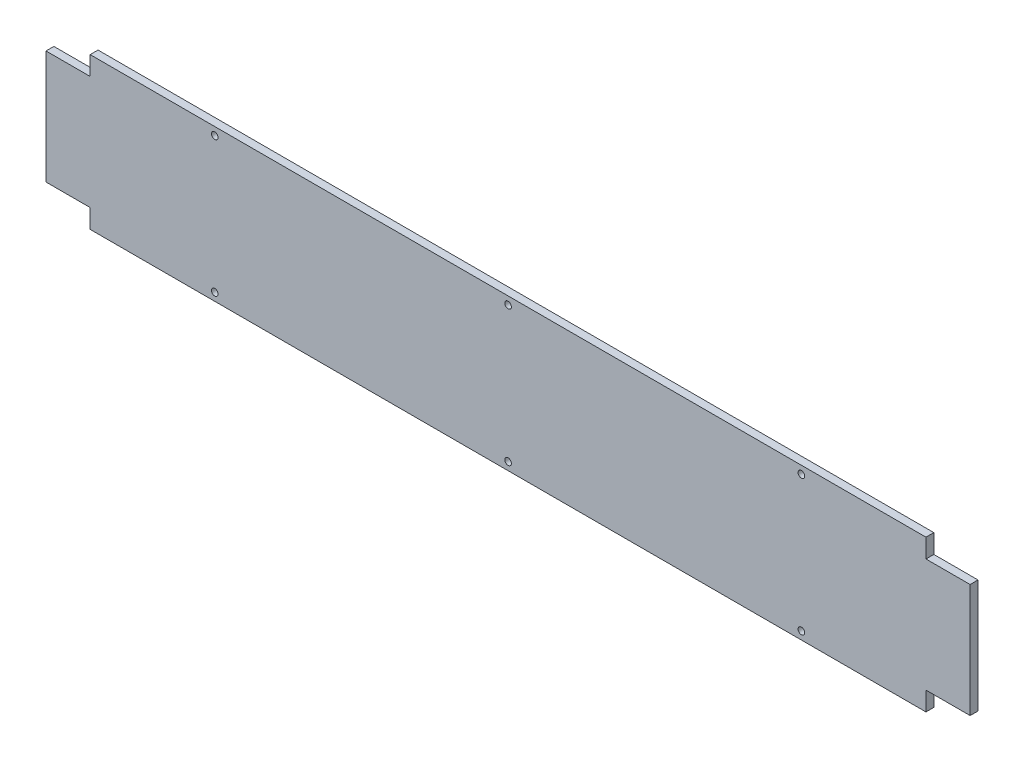
ISO-10303-21;
HEADER;
FILE_DESCRIPTION(('STEP AP214'),'2;1');
FILE_NAME('part.step','',(''),(''),'','','');
FILE_SCHEMA(('AUTOMOTIVE_DESIGN { 1 0 10303 214 1 1 1 1 }'));
ENDSEC;
DATA;
#1=APPLICATION_CONTEXT('core data for automotive mechanical design processes');
#2=APPLICATION_PROTOCOL_DEFINITION('international standard','automotive_design',2000,#1);
#3=PRODUCT_CONTEXT('',#1,'mechanical');
#4=PRODUCT('Part','Part','',(#3));
#5=PRODUCT_RELATED_PRODUCT_CATEGORY('part','',(#4));
#6=PRODUCT_DEFINITION_FORMATION('','',#4);
#7=PRODUCT_DEFINITION_CONTEXT('part definition',#1,'design');
#8=PRODUCT_DEFINITION('design','',#6,#7);
#9=PRODUCT_DEFINITION_SHAPE('','',#8);
#10=(LENGTH_UNIT() NAMED_UNIT(*) SI_UNIT(.MILLI.,.METRE.));
#11=(NAMED_UNIT(*) PLANE_ANGLE_UNIT() SI_UNIT($,.RADIAN.));
#12=(NAMED_UNIT(*) SI_UNIT($,.STERADIAN.) SOLID_ANGLE_UNIT());
#13=UNCERTAINTY_MEASURE_WITH_UNIT(LENGTH_MEASURE(1.E-05),#10,'distance_accuracy_value','');
#14=(GEOMETRIC_REPRESENTATION_CONTEXT(3) GLOBAL_UNCERTAINTY_ASSIGNED_CONTEXT((#13)) GLOBAL_UNIT_ASSIGNED_CONTEXT((#10,
#11,#12)) REPRESENTATION_CONTEXT('',''));
#15=CARTESIAN_POINT('',(0.,0.,0.));
#16=DIRECTION('',(0.,0.,1.));
#17=DIRECTION('',(1.,0.,0.));
#18=AXIS2_PLACEMENT_3D('',#15,#16,#17);
#19=CARTESIAN_POINT('',(0.,0.,5.));
#20=DIRECTION('',(1.,0.,0.));
#21=DIRECTION('',(0.,0.,-1.));
#22=AXIS2_PLACEMENT_3D('',#19,#20,#21);
#23=PLANE('',#22);
#24=DIRECTION('',(0.,0.,1.));
#25=VECTOR('',#24,1.);
#26=CARTESIAN_POINT('',(0.,12.,0.));
#27=LINE('',#26,#25);
#28=CARTESIAN_POINT('',(0.,12.,0.));
#29=VERTEX_POINT('',#28);
#30=CARTESIAN_POINT('',(0.,12.,5.));
#31=VERTEX_POINT('',#30);
#32=EDGE_CURVE('E135',#29,#31,#27,.T.);
#33=ORIENTED_EDGE('',*,*,#32,.F.);
#34=DIRECTION('',(0.,-1.,0.));
#35=VECTOR('',#34,1.);
#36=CARTESIAN_POINT('',(0.,0.,0.));
#37=LINE('',#36,#35);
#38=CARTESIAN_POINT('',(0.,0.,0.));
#39=VERTEX_POINT('',#38);
#40=EDGE_CURVE('E188',#29,#39,#37,.T.);
#41=ORIENTED_EDGE('',*,*,#40,.T.);
#42=DIRECTION('',(0.,0.,-1.));
#43=VECTOR('',#42,1.);
#44=CARTESIAN_POINT('',(0.,0.,5.));
#45=LINE('',#44,#43);
#46=CARTESIAN_POINT('',(0.,0.,5.));
#47=VERTEX_POINT('',#46);
#48=EDGE_CURVE('E11',#47,#39,#45,.T.);
#49=ORIENTED_EDGE('',*,*,#48,.F.);
#50=DIRECTION('',(0.,-1.,0.));
#51=VECTOR('',#50,1.);
#52=CARTESIAN_POINT('',(0.,0.,5.));
#53=LINE('',#52,#51);
#54=EDGE_CURVE('E151',#31,#47,#53,.T.);
#55=ORIENTED_EDGE('',*,*,#54,.F.);
#56=EDGE_LOOP('',(#33,#41,#49,#55));
#57=FACE_BOUND('',#56,.T.);
#58=ADVANCED_FACE('F45',(#57),#23,.F.);
#59=CARTESIAN_POINT('',(530.,0.,5.));
#60=DIRECTION('',(-1.,0.,0.));
#61=DIRECTION('',(0.,0.,1.));
#62=AXIS2_PLACEMENT_3D('',#59,#60,#61);
#63=PLANE('',#62);
#64=DIRECTION('',(0.,0.,1.));
#65=VECTOR('',#64,1.);
#66=CARTESIAN_POINT('',(530.,84.,0.));
#67=LINE('',#66,#65);
#68=CARTESIAN_POINT('',(530.,84.,0.));
#69=VERTEX_POINT('',#68);
#70=CARTESIAN_POINT('',(530.,84.,5.));
#71=VERTEX_POINT('',#70);
#72=EDGE_CURVE('E241',#69,#71,#67,.T.);
#73=ORIENTED_EDGE('',*,*,#72,.F.);
#74=DIRECTION('',(0.,1.,0.));
#75=VECTOR('',#74,1.);
#76=CARTESIAN_POINT('',(530.,0.,0.));
#77=LINE('',#76,#75);
#78=CARTESIAN_POINT('',(530.,96.,0.));
#79=VERTEX_POINT('',#78);
#80=EDGE_CURVE('E191',#69,#79,#77,.T.);
#81=ORIENTED_EDGE('',*,*,#80,.T.);
#82=DIRECTION('',(0.,0.,-1.));
#83=VECTOR('',#82,1.);
#84=CARTESIAN_POINT('',(530.,96.,5.));
#85=LINE('',#84,#83);
#86=CARTESIAN_POINT('',(530.,96.,5.));
#87=VERTEX_POINT('',#86);
#88=EDGE_CURVE('E198',#87,#79,#85,.T.);
#89=ORIENTED_EDGE('',*,*,#88,.F.);
#90=DIRECTION('',(0.,1.,0.));
#91=VECTOR('',#90,1.);
#92=CARTESIAN_POINT('',(530.,0.,5.));
#93=LINE('',#92,#91);
#94=EDGE_CURVE('E174',#71,#87,#93,.T.);
#95=ORIENTED_EDGE('',*,*,#94,.F.);
#96=EDGE_LOOP('',(#73,#81,#89,#95));
#97=FACE_BOUND('',#96,.T.);
#98=ADVANCED_FACE('F320',(#97),#63,.F.);
#99=CARTESIAN_POINT('',(0.,96.,0.));
#100=VERTEX_POINT('',#99);
#101=CARTESIAN_POINT('',(0.,84.,0.));
#102=VERTEX_POINT('',#101);
#103=EDGE_CURVE('E183',#100,#102,#37,.T.);
#104=ORIENTED_EDGE('',*,*,#103,.T.);
#105=DIRECTION('',(0.,0.,1.));
#106=VECTOR('',#105,1.);
#107=CARTESIAN_POINT('',(0.,84.,0.));
#108=LINE('',#107,#106);
#109=CARTESIAN_POINT('',(0.,84.,5.));
#110=VERTEX_POINT('',#109);
#111=EDGE_CURVE('E334',#102,#110,#108,.T.);
#112=ORIENTED_EDGE('',*,*,#111,.T.);
#113=CARTESIAN_POINT('',(0.,96.,5.));
#114=VERTEX_POINT('',#113);
#115=EDGE_CURVE('E160',#114,#110,#53,.T.);
#116=ORIENTED_EDGE('',*,*,#115,.F.);
#117=DIRECTION('',(0.,0.,-1.));
#118=VECTOR('',#117,1.);
#119=CARTESIAN_POINT('',(0.,96.,5.));
#120=LINE('',#119,#118);
#121=EDGE_CURVE('E182',#114,#100,#120,.T.);
#122=ORIENTED_EDGE('',*,*,#121,.T.);
#123=EDGE_LOOP('',(#104,#112,#116,#122));
#124=FACE_BOUND('',#123,.T.);
#125=ADVANCED_FACE('F47',(#124),#23,.F.);
#126=CARTESIAN_POINT('',(0.,0.,5.));
#127=DIRECTION('',(0.,1.,0.));
#128=DIRECTION('',(0.,0.,1.));
#129=AXIS2_PLACEMENT_3D('',#126,#127,#128);
#130=PLANE('',#129);
#131=DIRECTION('',(1.,0.,0.));
#132=VECTOR('',#131,1.);
#133=CARTESIAN_POINT('',(0.,0.,0.));
#134=LINE('',#133,#132);
#135=CARTESIAN_POINT('',(530.,0.,0.));
#136=VERTEX_POINT('',#135);
#137=EDGE_CURVE('E187',#39,#136,#134,.T.);
#138=ORIENTED_EDGE('',*,*,#137,.T.);
#139=DIRECTION('',(0.,0.,-1.));
#140=VECTOR('',#139,1.);
#141=CARTESIAN_POINT('',(530.,0.,5.));
#142=LINE('',#141,#140);
#143=CARTESIAN_POINT('',(530.,0.,5.));
#144=VERTEX_POINT('',#143);
#145=EDGE_CURVE('E54',#144,#136,#142,.T.);
#146=ORIENTED_EDGE('',*,*,#145,.F.);
#147=DIRECTION('',(1.,0.,0.));
#148=VECTOR('',#147,1.);
#149=CARTESIAN_POINT('',(0.,0.,5.));
#150=LINE('',#149,#148);
#151=EDGE_CURVE('E165',#47,#144,#150,.T.);
#152=ORIENTED_EDGE('',*,*,#151,.F.);
#153=ORIENTED_EDGE('',*,*,#48,.T.);
#154=EDGE_LOOP('',(#138,#146,#152,#153));
#155=FACE_BOUND('',#154,.T.);
#156=ADVANCED_FACE('F328',(#155),#130,.F.);
#157=CARTESIAN_POINT('',(530.,12.,0.));
#158=VERTEX_POINT('',#157);
#159=EDGE_CURVE('E166',#136,#158,#77,.T.);
#160=ORIENTED_EDGE('',*,*,#159,.T.);
#161=DIRECTION('',(0.,0.,1.));
#162=VECTOR('',#161,1.);
#163=CARTESIAN_POINT('',(530.,12.,0.));
#164=LINE('',#163,#162);
#165=CARTESIAN_POINT('',(530.,12.,5.));
#166=VERTEX_POINT('',#165);
#167=EDGE_CURVE('E235',#158,#166,#164,.T.);
#168=ORIENTED_EDGE('',*,*,#167,.T.);
#169=EDGE_CURVE('E175',#144,#166,#93,.T.);
#170=ORIENTED_EDGE('',*,*,#169,.F.);
#171=ORIENTED_EDGE('',*,*,#145,.T.);
#172=EDGE_LOOP('',(#160,#168,#170,#171));
#173=FACE_BOUND('',#172,.T.);
#174=ADVANCED_FACE('F207',(#173),#63,.F.);
#175=CARTESIAN_POINT('',(0.,96.,5.));
#176=DIRECTION('',(0.,-1.,0.));
#177=DIRECTION('',(0.,0.,-1.));
#178=AXIS2_PLACEMENT_3D('',#175,#176,#177);
#179=PLANE('',#178);
#180=DIRECTION('',(-1.,0.,0.));
#181=VECTOR('',#180,1.);
#182=CARTESIAN_POINT('',(0.,96.,0.));
#183=LINE('',#182,#181);
#184=EDGE_CURVE('E161',#79,#100,#183,.T.);
#185=ORIENTED_EDGE('',*,*,#184,.T.);
#186=ORIENTED_EDGE('',*,*,#121,.F.);
#187=DIRECTION('',(-1.,0.,0.));
#188=VECTOR('',#187,1.);
#189=CARTESIAN_POINT('',(0.,96.,5.));
#190=LINE('',#189,#188);
#191=EDGE_CURVE('E179',#87,#114,#190,.T.);
#192=ORIENTED_EDGE('',*,*,#191,.F.);
#193=ORIENTED_EDGE('',*,*,#88,.T.);
#194=EDGE_LOOP('',(#185,#186,#192,#193));
#195=FACE_BOUND('',#194,.T.);
#196=ADVANCED_FACE('F304',(#195),#179,.F.);
#197=CARTESIAN_POINT('',(0.,0.,5.));
#198=DIRECTION('',(0.,0.,-1.));
#199=DIRECTION('',(-1.,0.,0.));
#200=AXIS2_PLACEMENT_3D('',#197,#198,#199);
#201=PLANE('',#200);
#202=CARTESIAN_POINT('',(79.,5.,5.));
#203=DIRECTION('',(0.,0.,1.));
#204=DIRECTION('',(-1.,0.,0.));
#205=AXIS2_PLACEMENT_3D('',#202,#203,#204);
#206=CIRCLE('',#205,2.1);
#207=CARTESIAN_POINT('',(76.9,5.,5.));
#208=VERTEX_POINT('',#207);
#209=EDGE_CURVE('E285',#208,#208,#206,.T.);
#210=ORIENTED_EDGE('',*,*,#209,.F.);
#211=EDGE_LOOP('',(#210));
#212=FACE_BOUND('',#211,.T.);
#213=CARTESIAN_POINT('',(265.,5.,5.));
#214=DIRECTION('',(0.,0.,1.));
#215=DIRECTION('',(-1.,0.,0.));
#216=AXIS2_PLACEMENT_3D('',#213,#214,#215);
#217=CIRCLE('',#216,2.09999999999999);
#218=CARTESIAN_POINT('',(262.9,5.,5.));
#219=VERTEX_POINT('',#218);
#220=EDGE_CURVE('E277',#219,#219,#217,.T.);
#221=ORIENTED_EDGE('',*,*,#220,.F.);
#222=EDGE_LOOP('',(#221));
#223=FACE_BOUND('',#222,.T.);
#224=CARTESIAN_POINT('',(451.,5.,5.));
#225=DIRECTION('',(0.,0.,1.));
#226=DIRECTION('',(-1.,0.,0.));
#227=AXIS2_PLACEMENT_3D('',#224,#225,#226);
#228=CIRCLE('',#227,2.09999999999999);
#229=CARTESIAN_POINT('',(448.9,5.,5.));
#230=VERTEX_POINT('',#229);
#231=EDGE_CURVE('E269',#230,#230,#228,.T.);
#232=ORIENTED_EDGE('',*,*,#231,.F.);
#233=EDGE_LOOP('',(#232));
#234=FACE_BOUND('',#233,.T.);
#235=CARTESIAN_POINT('',(451.,91.,5.));
#236=DIRECTION('',(0.,0.,1.));
#237=DIRECTION('',(1.,0.,0.));
#238=AXIS2_PLACEMENT_3D('',#235,#236,#237);
#239=CIRCLE('',#238,2.09999999999999);
#240=CARTESIAN_POINT('',(453.1,91.,5.));
#241=VERTEX_POINT('',#240);
#242=EDGE_CURVE('E261',#241,#241,#239,.T.);
#243=ORIENTED_EDGE('',*,*,#242,.F.);
#244=EDGE_LOOP('',(#243));
#245=FACE_BOUND('',#244,.T.);
#246=CARTESIAN_POINT('',(265.,91.,5.));
#247=DIRECTION('',(0.,0.,1.));
#248=DIRECTION('',(1.,0.,0.));
#249=AXIS2_PLACEMENT_3D('',#246,#247,#248);
#250=CIRCLE('',#249,2.09999999999999);
#251=CARTESIAN_POINT('',(267.1,91.,5.));
#252=VERTEX_POINT('',#251);
#253=EDGE_CURVE('E253',#252,#252,#250,.T.);
#254=ORIENTED_EDGE('',*,*,#253,.F.);
#255=EDGE_LOOP('',(#254));
#256=FACE_BOUND('',#255,.T.);
#257=CARTESIAN_POINT('',(79.,91.,5.));
#258=DIRECTION('',(0.,0.,1.));
#259=DIRECTION('',(1.,0.,0.));
#260=AXIS2_PLACEMENT_3D('',#257,#258,#259);
#261=CIRCLE('',#260,2.1);
#262=CARTESIAN_POINT('',(81.1,91.,5.));
#263=VERTEX_POINT('',#262);
#264=EDGE_CURVE('E170',#263,#263,#261,.T.);
#265=ORIENTED_EDGE('',*,*,#264,.F.);
#266=EDGE_LOOP('',(#265));
#267=FACE_BOUND('',#266,.T.);
#268=ORIENTED_EDGE('',*,*,#115,.T.);
#269=DIRECTION('',(-1.,0.,0.));
#270=VECTOR('',#269,1.);
#271=CARTESIAN_POINT('',(0.,84.,5.));
#272=LINE('',#271,#270);
#273=CARTESIAN_POINT('',(-28.,84.,5.));
#274=VERTEX_POINT('',#273);
#275=EDGE_CURVE('E61',#110,#274,#272,.T.);
#276=ORIENTED_EDGE('',*,*,#275,.T.);
#277=DIRECTION('',(0.,-1.,0.));
#278=VECTOR('',#277,1.);
#279=CARTESIAN_POINT('',(-28.,84.,5.));
#280=LINE('',#279,#278);
#281=CARTESIAN_POINT('',(-28.,12.,5.));
#282=VERTEX_POINT('',#281);
#283=EDGE_CURVE('E154',#274,#282,#280,.T.);
#284=ORIENTED_EDGE('',*,*,#283,.T.);
#285=DIRECTION('',(1.,0.,0.));
#286=VECTOR('',#285,1.);
#287=CARTESIAN_POINT('',(0.,12.,5.));
#288=LINE('',#287,#286);
#289=EDGE_CURVE('E138',#282,#31,#288,.T.);
#290=ORIENTED_EDGE('',*,*,#289,.T.);
#291=ORIENTED_EDGE('',*,*,#54,.T.);
#292=ORIENTED_EDGE('',*,*,#151,.T.);
#293=ORIENTED_EDGE('',*,*,#169,.T.);
#294=DIRECTION('',(1.,0.,0.));
#295=VECTOR('',#294,1.);
#296=CARTESIAN_POINT('',(530.,12.,5.));
#297=LINE('',#296,#295);
#298=CARTESIAN_POINT('',(558.,12.,5.));
#299=VERTEX_POINT('',#298);
#300=EDGE_CURVE('E69',#166,#299,#297,.T.);
#301=ORIENTED_EDGE('',*,*,#300,.T.);
#302=DIRECTION('',(0.,1.,0.));
#303=VECTOR('',#302,1.);
#304=CARTESIAN_POINT('',(558.,84.,5.));
#305=LINE('',#304,#303);
#306=CARTESIAN_POINT('',(558.,84.,5.));
#307=VERTEX_POINT('',#306);
#308=EDGE_CURVE('E228',#299,#307,#305,.T.);
#309=ORIENTED_EDGE('',*,*,#308,.T.);
#310=DIRECTION('',(-1.,0.,0.));
#311=VECTOR('',#310,1.);
#312=CARTESIAN_POINT('',(530.,84.,5.));
#313=LINE('',#312,#311);
#314=EDGE_CURVE('E221',#307,#71,#313,.T.);
#315=ORIENTED_EDGE('',*,*,#314,.T.);
#316=ORIENTED_EDGE('',*,*,#94,.T.);
#317=ORIENTED_EDGE('',*,*,#191,.T.);
#318=EDGE_LOOP('',(#268,#276,#284,#290,#291,#292,#293,#301,#309,#315,#316,#317));
#319=FACE_BOUND('',#318,.T.);
#320=ADVANCED_FACE('F150',(#212,#223,#234,#245,#256,#267,#319),#201,.F.);
#321=CARTESIAN_POINT('',(0.,0.,0.));
#322=DIRECTION('',(0.,0.,-1.));
#323=DIRECTION('',(-1.,0.,0.));
#324=AXIS2_PLACEMENT_3D('',#321,#322,#323);
#325=PLANE('',#324);
#326=CARTESIAN_POINT('',(79.,5.,0.));
#327=DIRECTION('',(0.,0.,1.));
#328=DIRECTION('',(-1.,0.,0.));
#329=AXIS2_PLACEMENT_3D('',#326,#327,#328);
#330=CIRCLE('',#329,2.1);
#331=CARTESIAN_POINT('',(76.9,5.,0.));
#332=VERTEX_POINT('',#331);
#333=EDGE_CURVE('E244',#332,#332,#330,.T.);
#334=ORIENTED_EDGE('',*,*,#333,.T.);
#335=EDGE_LOOP('',(#334));
#336=FACE_BOUND('',#335,.T.);
#337=CARTESIAN_POINT('',(265.,5.,0.));
#338=DIRECTION('',(0.,0.,1.));
#339=DIRECTION('',(-1.,0.,0.));
#340=AXIS2_PLACEMENT_3D('',#337,#338,#339);
#341=CIRCLE('',#340,2.09999999999999);
#342=CARTESIAN_POINT('',(262.9,5.,0.));
#343=VERTEX_POINT('',#342);
#344=EDGE_CURVE('E281',#343,#343,#341,.T.);
#345=ORIENTED_EDGE('',*,*,#344,.T.);
#346=EDGE_LOOP('',(#345));
#347=FACE_BOUND('',#346,.T.);
#348=CARTESIAN_POINT('',(451.,5.,0.));
#349=DIRECTION('',(0.,0.,1.));
#350=DIRECTION('',(-1.,0.,0.));
#351=AXIS2_PLACEMENT_3D('',#348,#349,#350);
#352=CIRCLE('',#351,2.09999999999999);
#353=CARTESIAN_POINT('',(448.9,5.,0.));
#354=VERTEX_POINT('',#353);
#355=EDGE_CURVE('E273',#354,#354,#352,.T.);
#356=ORIENTED_EDGE('',*,*,#355,.T.);
#357=EDGE_LOOP('',(#356));
#358=FACE_BOUND('',#357,.T.);
#359=CARTESIAN_POINT('',(451.,91.,0.));
#360=DIRECTION('',(0.,0.,1.));
#361=DIRECTION('',(1.,0.,0.));
#362=AXIS2_PLACEMENT_3D('',#359,#360,#361);
#363=CIRCLE('',#362,2.09999999999999);
#364=CARTESIAN_POINT('',(453.1,91.,0.));
#365=VERTEX_POINT('',#364);
#366=EDGE_CURVE('E265',#365,#365,#363,.T.);
#367=ORIENTED_EDGE('',*,*,#366,.T.);
#368=EDGE_LOOP('',(#367));
#369=FACE_BOUND('',#368,.T.);
#370=CARTESIAN_POINT('',(265.,91.,0.));
#371=DIRECTION('',(0.,0.,1.));
#372=DIRECTION('',(1.,0.,0.));
#373=AXIS2_PLACEMENT_3D('',#370,#371,#372);
#374=CIRCLE('',#373,2.09999999999999);
#375=CARTESIAN_POINT('',(267.1,91.,0.));
#376=VERTEX_POINT('',#375);
#377=EDGE_CURVE('E257',#376,#376,#374,.T.);
#378=ORIENTED_EDGE('',*,*,#377,.T.);
#379=EDGE_LOOP('',(#378));
#380=FACE_BOUND('',#379,.T.);
#381=CARTESIAN_POINT('',(79.,91.,0.));
#382=DIRECTION('',(0.,0.,1.));
#383=DIRECTION('',(1.,0.,0.));
#384=AXIS2_PLACEMENT_3D('',#381,#382,#383);
#385=CIRCLE('',#384,2.1);
#386=CARTESIAN_POINT('',(81.1,91.,0.));
#387=VERTEX_POINT('',#386);
#388=EDGE_CURVE('E291',#387,#387,#385,.T.);
#389=ORIENTED_EDGE('',*,*,#388,.T.);
#390=EDGE_LOOP('',(#389));
#391=FACE_BOUND('',#390,.T.);
#392=ORIENTED_EDGE('',*,*,#103,.F.);
#393=ORIENTED_EDGE('',*,*,#184,.F.);
#394=ORIENTED_EDGE('',*,*,#80,.F.);
#395=DIRECTION('',(-1.,0.,0.));
#396=VECTOR('',#395,1.);
#397=CARTESIAN_POINT('',(530.,84.,0.));
#398=LINE('',#397,#396);
#399=CARTESIAN_POINT('',(558.,84.,0.));
#400=VERTEX_POINT('',#399);
#401=EDGE_CURVE('E225',#400,#69,#398,.T.);
#402=ORIENTED_EDGE('',*,*,#401,.F.);
#403=DIRECTION('',(0.,1.,0.));
#404=VECTOR('',#403,1.);
#405=CARTESIAN_POINT('',(558.,84.,0.));
#406=LINE('',#405,#404);
#407=CARTESIAN_POINT('',(558.,12.,0.));
#408=VERTEX_POINT('',#407);
#409=EDGE_CURVE('E219',#408,#400,#406,.T.);
#410=ORIENTED_EDGE('',*,*,#409,.F.);
#411=DIRECTION('',(1.,0.,0.));
#412=VECTOR('',#411,1.);
#413=CARTESIAN_POINT('',(530.,12.,0.));
#414=LINE('',#413,#412);
#415=EDGE_CURVE('E216',#158,#408,#414,.T.);
#416=ORIENTED_EDGE('',*,*,#415,.F.);
#417=ORIENTED_EDGE('',*,*,#159,.F.);
#418=ORIENTED_EDGE('',*,*,#137,.F.);
#419=ORIENTED_EDGE('',*,*,#40,.F.);
#420=DIRECTION('',(1.,0.,0.));
#421=VECTOR('',#420,1.);
#422=CARTESIAN_POINT('',(0.,12.,0.));
#423=LINE('',#422,#421);
#424=CARTESIAN_POINT('',(-28.,12.,0.));
#425=VERTEX_POINT('',#424);
#426=EDGE_CURVE('E140',#425,#29,#423,.T.);
#427=ORIENTED_EDGE('',*,*,#426,.F.);
#428=DIRECTION('',(0.,-1.,0.));
#429=VECTOR('',#428,1.);
#430=CARTESIAN_POINT('',(-28.,84.,0.));
#431=LINE('',#430,#429);
#432=CARTESIAN_POINT('',(-28.,84.,0.));
#433=VERTEX_POINT('',#432);
#434=EDGE_CURVE('E342',#433,#425,#431,.T.);
#435=ORIENTED_EDGE('',*,*,#434,.F.);
#436=DIRECTION('',(-1.,0.,0.));
#437=VECTOR('',#436,1.);
#438=CARTESIAN_POINT('',(0.,84.,0.));
#439=LINE('',#438,#437);
#440=EDGE_CURVE('E156',#102,#433,#439,.T.);
#441=ORIENTED_EDGE('',*,*,#440,.F.);
#442=EDGE_LOOP('',(#392,#393,#394,#402,#410,#416,#417,#418,#419,#427,#435,#441));
#443=FACE_BOUND('',#442,.T.);
#444=ADVANCED_FACE('F213',(#336,#347,#358,#369,#380,#391,#443),#325,.T.);
#445=CARTESIAN_POINT('',(79.,91.,0.));
#446=DIRECTION('',(0.,0.,1.));
#447=DIRECTION('',(1.,0.,0.));
#448=AXIS2_PLACEMENT_3D('',#445,#446,#447);
#449=CYLINDRICAL_SURFACE('',#448,2.1);
#450=ORIENTED_EDGE('',*,*,#388,.F.);
#451=EDGE_LOOP('',(#450));
#452=FACE_BOUND('',#451,.T.);
#453=ORIENTED_EDGE('',*,*,#264,.T.);
#454=EDGE_LOOP('',(#453));
#455=FACE_BOUND('',#454,.T.);
#456=ADVANCED_FACE('F301',(#452,#455),#449,.F.);
#457=CARTESIAN_POINT('',(265.,91.,0.));
#458=DIRECTION('',(0.,0.,1.));
#459=DIRECTION('',(1.,0.,0.));
#460=AXIS2_PLACEMENT_3D('',#457,#458,#459);
#461=CYLINDRICAL_SURFACE('',#460,2.09999999999999);
#462=ORIENTED_EDGE('',*,*,#377,.F.);
#463=EDGE_LOOP('',(#462));
#464=FACE_BOUND('',#463,.T.);
#465=ORIENTED_EDGE('',*,*,#253,.T.);
#466=EDGE_LOOP('',(#465));
#467=FACE_BOUND('',#466,.T.);
#468=ADVANCED_FACE('F383',(#464,#467),#461,.F.);
#469=CARTESIAN_POINT('',(451.,91.,0.));
#470=DIRECTION('',(0.,0.,1.));
#471=DIRECTION('',(1.,0.,0.));
#472=AXIS2_PLACEMENT_3D('',#469,#470,#471);
#473=CYLINDRICAL_SURFACE('',#472,2.09999999999999);
#474=ORIENTED_EDGE('',*,*,#366,.F.);
#475=EDGE_LOOP('',(#474));
#476=FACE_BOUND('',#475,.T.);
#477=ORIENTED_EDGE('',*,*,#242,.T.);
#478=EDGE_LOOP('',(#477));
#479=FACE_BOUND('',#478,.T.);
#480=ADVANCED_FACE('F386',(#476,#479),#473,.F.);
#481=CARTESIAN_POINT('',(451.,5.,0.));
#482=DIRECTION('',(0.,0.,1.));
#483=DIRECTION('',(1.,0.,0.));
#484=AXIS2_PLACEMENT_3D('',#481,#482,#483);
#485=CYLINDRICAL_SURFACE('',#484,2.09999999999999);
#486=ORIENTED_EDGE('',*,*,#355,.F.);
#487=EDGE_LOOP('',(#486));
#488=FACE_BOUND('',#487,.T.);
#489=ORIENTED_EDGE('',*,*,#231,.T.);
#490=EDGE_LOOP('',(#489));
#491=FACE_BOUND('',#490,.T.);
#492=ADVANCED_FACE('F390',(#488,#491),#485,.F.);
#493=CARTESIAN_POINT('',(265.,5.,0.));
#494=DIRECTION('',(0.,0.,1.));
#495=DIRECTION('',(1.,0.,0.));
#496=AXIS2_PLACEMENT_3D('',#493,#494,#495);
#497=CYLINDRICAL_SURFACE('',#496,2.09999999999999);
#498=ORIENTED_EDGE('',*,*,#344,.F.);
#499=EDGE_LOOP('',(#498));
#500=FACE_BOUND('',#499,.T.);
#501=ORIENTED_EDGE('',*,*,#220,.T.);
#502=EDGE_LOOP('',(#501));
#503=FACE_BOUND('',#502,.T.);
#504=ADVANCED_FACE('F394',(#500,#503),#497,.F.);
#505=CARTESIAN_POINT('',(79.,5.,0.));
#506=DIRECTION('',(0.,0.,1.));
#507=DIRECTION('',(1.,0.,0.));
#508=AXIS2_PLACEMENT_3D('',#505,#506,#507);
#509=CYLINDRICAL_SURFACE('',#508,2.1);
#510=ORIENTED_EDGE('',*,*,#333,.F.);
#511=EDGE_LOOP('',(#510));
#512=FACE_BOUND('',#511,.T.);
#513=ORIENTED_EDGE('',*,*,#209,.T.);
#514=EDGE_LOOP('',(#513));
#515=FACE_BOUND('',#514,.T.);
#516=ADVANCED_FACE('F398',(#512,#515),#509,.F.);
#517=CARTESIAN_POINT('',(530.,84.,0.));
#518=DIRECTION('',(0.,1.,0.));
#519=DIRECTION('',(0.,0.,1.));
#520=AXIS2_PLACEMENT_3D('',#517,#518,#519);
#521=PLANE('',#520);
#522=ORIENTED_EDGE('',*,*,#314,.F.);
#523=DIRECTION('',(0.,0.,1.));
#524=VECTOR('',#523,1.);
#525=CARTESIAN_POINT('',(558.,84.,0.));
#526=LINE('',#525,#524);
#527=EDGE_CURVE('E245',#400,#307,#526,.T.);
#528=ORIENTED_EDGE('',*,*,#527,.F.);
#529=ORIENTED_EDGE('',*,*,#401,.T.);
#530=ORIENTED_EDGE('',*,*,#72,.T.);
#531=EDGE_LOOP('',(#522,#528,#529,#530));
#532=FACE_BOUND('',#531,.T.);
#533=ADVANCED_FACE('F368',(#532),#521,.T.);
#534=CARTESIAN_POINT('',(558.,84.,0.));
#535=DIRECTION('',(1.,0.,0.));
#536=DIRECTION('',(0.,0.,-1.));
#537=AXIS2_PLACEMENT_3D('',#534,#535,#536);
#538=PLANE('',#537);
#539=ORIENTED_EDGE('',*,*,#308,.F.);
#540=DIRECTION('',(0.,0.,1.));
#541=VECTOR('',#540,1.);
#542=CARTESIAN_POINT('',(558.,12.,0.));
#543=LINE('',#542,#541);
#544=EDGE_CURVE('E248',#408,#299,#543,.T.);
#545=ORIENTED_EDGE('',*,*,#544,.F.);
#546=ORIENTED_EDGE('',*,*,#409,.T.);
#547=ORIENTED_EDGE('',*,*,#527,.T.);
#548=EDGE_LOOP('',(#539,#545,#546,#547));
#549=FACE_BOUND('',#548,.T.);
#550=ADVANCED_FACE('F371',(#549),#538,.T.);
#551=CARTESIAN_POINT('',(530.,12.,0.));
#552=DIRECTION('',(0.,-1.,0.));
#553=DIRECTION('',(0.,0.,-1.));
#554=AXIS2_PLACEMENT_3D('',#551,#552,#553);
#555=PLANE('',#554);
#556=ORIENTED_EDGE('',*,*,#300,.F.);
#557=ORIENTED_EDGE('',*,*,#167,.F.);
#558=ORIENTED_EDGE('',*,*,#415,.T.);
#559=ORIENTED_EDGE('',*,*,#544,.T.);
#560=EDGE_LOOP('',(#556,#557,#558,#559));
#561=FACE_BOUND('',#560,.T.);
#562=ADVANCED_FACE('F372',(#561),#555,.T.);
#563=CARTESIAN_POINT('',(0.,12.,0.));
#564=DIRECTION('',(0.,-1.,0.));
#565=DIRECTION('',(1.,0.,0.));
#566=AXIS2_PLACEMENT_3D('',#563,#564,#565);
#567=PLANE('',#566);
#568=ORIENTED_EDGE('',*,*,#289,.F.);
#569=DIRECTION('',(0.,0.,1.));
#570=VECTOR('',#569,1.);
#571=CARTESIAN_POINT('',(-28.,12.,0.));
#572=LINE('',#571,#570);
#573=EDGE_CURVE('E145',#425,#282,#572,.T.);
#574=ORIENTED_EDGE('',*,*,#573,.F.);
#575=ORIENTED_EDGE('',*,*,#426,.T.);
#576=ORIENTED_EDGE('',*,*,#32,.T.);
#577=EDGE_LOOP('',(#568,#574,#575,#576));
#578=FACE_BOUND('',#577,.T.);
#579=ADVANCED_FACE('F137',(#578),#567,.T.);
#580=CARTESIAN_POINT('',(-28.,84.,0.));
#581=DIRECTION('',(-1.,0.,0.));
#582=DIRECTION('',(0.,-1.,0.));
#583=AXIS2_PLACEMENT_3D('',#580,#581,#582);
#584=PLANE('',#583);
#585=ORIENTED_EDGE('',*,*,#283,.F.);
#586=DIRECTION('',(0.,0.,1.));
#587=VECTOR('',#586,1.);
#588=CARTESIAN_POINT('',(-28.,84.,0.));
#589=LINE('',#588,#587);
#590=EDGE_CURVE('E355',#433,#274,#589,.T.);
#591=ORIENTED_EDGE('',*,*,#590,.F.);
#592=ORIENTED_EDGE('',*,*,#434,.T.);
#593=ORIENTED_EDGE('',*,*,#573,.T.);
#594=EDGE_LOOP('',(#585,#591,#592,#593));
#595=FACE_BOUND('',#594,.T.);
#596=ADVANCED_FACE('F360',(#595),#584,.T.);
#597=CARTESIAN_POINT('',(0.,84.,0.));
#598=DIRECTION('',(0.,1.,0.));
#599=DIRECTION('',(0.,0.,1.));
#600=AXIS2_PLACEMENT_3D('',#597,#598,#599);
#601=PLANE('',#600);
#602=ORIENTED_EDGE('',*,*,#275,.F.);
#603=ORIENTED_EDGE('',*,*,#111,.F.);
#604=ORIENTED_EDGE('',*,*,#440,.T.);
#605=ORIENTED_EDGE('',*,*,#590,.T.);
#606=EDGE_LOOP('',(#602,#603,#604,#605));
#607=FACE_BOUND('',#606,.T.);
#608=ADVANCED_FACE('F359',(#607),#601,.T.);
#609=CLOSED_SHELL('',(#58,#98,#125,#156,#174,#196,#320,#444,#456,#468,#480,#492,#504,#516,#533,
#550,#562,#579,#596,#608));
#610=MANIFOLD_SOLID_BREP('B2',#609);
#611=ADVANCED_BREP_SHAPE_REPRESENTATION('',(#18,#610),#14);
#612=SHAPE_DEFINITION_REPRESENTATION(#9,#611);
ENDSEC;
END-ISO-10303-21;
